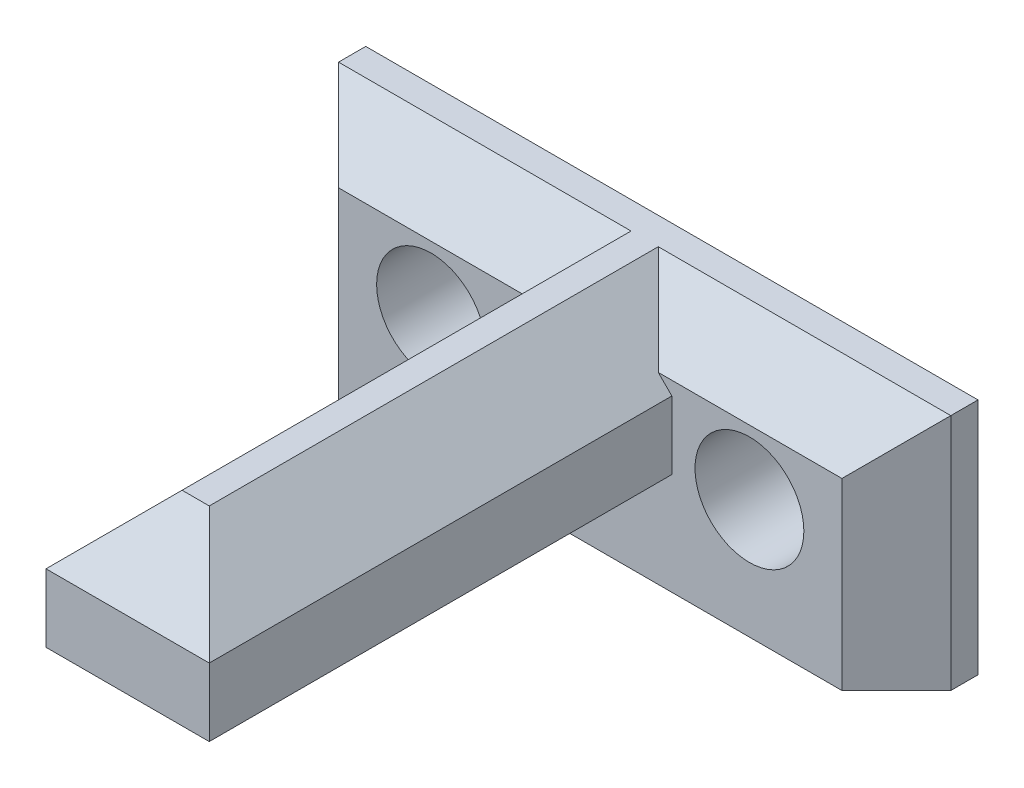
ISO-10303-21;
HEADER;
FILE_DESCRIPTION(('STEP AP214'),'2;1');
FILE_NAME('part.step','',(''),(''),'','','');
FILE_SCHEMA(('AUTOMOTIVE_DESIGN { 1 0 10303 214 1 1 1 1 }'));
ENDSEC;
DATA;
#1=APPLICATION_CONTEXT('core data for automotive mechanical design processes');
#2=APPLICATION_PROTOCOL_DEFINITION('international standard','automotive_design',2000,#1);
#3=PRODUCT_CONTEXT('',#1,'mechanical');
#4=PRODUCT('Part','Part','',(#3));
#5=PRODUCT_RELATED_PRODUCT_CATEGORY('part','',(#4));
#6=PRODUCT_DEFINITION_FORMATION('','',#4);
#7=PRODUCT_DEFINITION_CONTEXT('part definition',#1,'design');
#8=PRODUCT_DEFINITION('design','',#6,#7);
#9=PRODUCT_DEFINITION_SHAPE('','',#8);
#10=(LENGTH_UNIT() NAMED_UNIT(*) SI_UNIT(.MILLI.,.METRE.));
#11=(NAMED_UNIT(*) PLANE_ANGLE_UNIT() SI_UNIT($,.RADIAN.));
#12=(NAMED_UNIT(*) SI_UNIT($,.STERADIAN.) SOLID_ANGLE_UNIT());
#13=UNCERTAINTY_MEASURE_WITH_UNIT(LENGTH_MEASURE(1.E-05),#10,'distance_accuracy_value','');
#14=(GEOMETRIC_REPRESENTATION_CONTEXT(3) GLOBAL_UNCERTAINTY_ASSIGNED_CONTEXT((#13)) GLOBAL_UNIT_ASSIGNED_CONTEXT((#10,
#11,#12)) REPRESENTATION_CONTEXT('',''));
#15=CARTESIAN_POINT('',(0.,0.,0.));
#16=DIRECTION('',(0.,0.,1.));
#17=DIRECTION('',(1.,0.,0.));
#18=AXIS2_PLACEMENT_3D('',#15,#16,#17);
#19=CARTESIAN_POINT('',(0.,0.,3.));
#20=DIRECTION('',(0.,0.,-1.));
#21=DIRECTION('',(-1.,0.,0.));
#22=AXIS2_PLACEMENT_3D('',#19,#20,#21);
#23=PLANE('',#22);
#24=CARTESIAN_POINT('',(-5.85,0.,3.));
#25=DIRECTION('',(0.,0.,1.));
#26=DIRECTION('',(-1.,0.,0.));
#27=AXIS2_PLACEMENT_3D('',#24,#25,#26);
#28=CIRCLE('',#27,2.);
#29=CARTESIAN_POINT('',(-7.85,0.,3.));
#30=VERTEX_POINT('',#29);
#31=EDGE_CURVE('E190',#30,#30,#28,.T.);
#32=ORIENTED_EDGE('',*,*,#31,.F.);
#33=EDGE_LOOP('',(#32));
#34=FACE_BOUND('',#33,.T.);
#35=CARTESIAN_POINT('',(5.85,0.,3.));
#36=DIRECTION('',(0.,0.,1.));
#37=DIRECTION('',(1.,0.,0.));
#38=AXIS2_PLACEMENT_3D('',#35,#36,#37);
#39=CIRCLE('',#38,2.);
#40=CARTESIAN_POINT('',(7.85,0.,3.));
#41=VERTEX_POINT('',#40);
#42=EDGE_CURVE('E198',#41,#41,#39,.T.);
#43=ORIENTED_EDGE('',*,*,#42,.F.);
#44=EDGE_LOOP('',(#43));
#45=FACE_BOUND('',#44,.T.);
#46=DIRECTION('',(1.,0.,0.));
#47=VECTOR('',#46,1.);
#48=CARTESIAN_POINT('',(-11.25,-4.375,3.));
#49=LINE('',#48,#47);
#50=CARTESIAN_POINT('',(-9.25000000000001,-4.375,3.));
#51=VERTEX_POINT('',#50);
#52=CARTESIAN_POINT('',(9.25,-4.375,3.));
#53=VERTEX_POINT('',#52);
#54=EDGE_CURVE('E206',#51,#53,#49,.T.);
#55=ORIENTED_EDGE('',*,*,#54,.T.);
#56=DIRECTION('',(0.,1.,0.));
#57=VECTOR('',#56,1.);
#58=CARTESIAN_POINT('',(9.25000000000001,0.,3.));
#59=LINE('',#58,#57);
#60=CARTESIAN_POINT('',(9.25000000000001,2.37500000000001,3.));
#61=VERTEX_POINT('',#60);
#62=EDGE_CURVE('E244',#53,#61,#59,.T.);
#63=ORIENTED_EDGE('',*,*,#62,.T.);
#64=DIRECTION('',(-1.,0.,0.));
#65=VECTOR('',#64,1.);
#66=CARTESIAN_POINT('',(0.,2.37500000000001,3.));
#67=LINE('',#66,#65);
#68=CARTESIAN_POINT('',(2.49999999999999,2.37500000000001,3.));
#69=VERTEX_POINT('',#68);
#70=EDGE_CURVE('E70',#61,#69,#67,.T.);
#71=ORIENTED_EDGE('',*,*,#70,.T.);
#72=DIRECTION('',(-0.707106781186547,0.707106781186548,0.));
#73=VECTOR('',#72,1.);
#74=CARTESIAN_POINT('',(2.4375,2.4375,3.));
#75=LINE('',#74,#73);
#76=CARTESIAN_POINT('',(3.,1.875,3.));
#77=VERTEX_POINT('',#76);
#78=EDGE_CURVE('E290',#69,#77,#75,.F.);
#79=ORIENTED_EDGE('',*,*,#78,.T.);
#80=DIRECTION('',(0.,1.,0.));
#81=VECTOR('',#80,1.);
#82=CARTESIAN_POINT('',(3.,-0.625000000000001,3.));
#83=LINE('',#82,#81);
#84=CARTESIAN_POINT('',(3.,-0.625000000000001,3.));
#85=VERTEX_POINT('',#84);
#86=EDGE_CURVE('E169',#85,#77,#83,.T.);
#87=ORIENTED_EDGE('',*,*,#86,.F.);
#88=DIRECTION('',(1.,0.,0.));
#89=VECTOR('',#88,1.);
#90=CARTESIAN_POINT('',(0.,-0.625000000000001,3.));
#91=LINE('',#90,#89);
#92=CARTESIAN_POINT('',(-3.,-0.625000000000001,3.));
#93=VERTEX_POINT('',#92);
#94=EDGE_CURVE('E160',#93,#85,#91,.T.);
#95=ORIENTED_EDGE('',*,*,#94,.F.);
#96=DIRECTION('',(0.,1.,0.));
#97=VECTOR('',#96,1.);
#98=CARTESIAN_POINT('',(-3.,-0.625000000000001,3.));
#99=LINE('',#98,#97);
#100=CARTESIAN_POINT('',(-3.,1.875,3.));
#101=VERTEX_POINT('',#100);
#102=EDGE_CURVE('E144',#93,#101,#99,.T.);
#103=ORIENTED_EDGE('',*,*,#102,.T.);
#104=DIRECTION('',(0.707106781186547,0.707106781186548,0.));
#105=VECTOR('',#104,1.);
#106=CARTESIAN_POINT('',(-2.4375,2.4375,3.));
#107=LINE('',#106,#105);
#108=CARTESIAN_POINT('',(-2.49999999999999,2.37500000000001,3.));
#109=VERTEX_POINT('',#108);
#110=EDGE_CURVE('E55',#101,#109,#107,.T.);
#111=ORIENTED_EDGE('',*,*,#110,.T.);
#112=DIRECTION('',(-1.,0.,0.));
#113=VECTOR('',#112,1.);
#114=CARTESIAN_POINT('',(0.,2.37500000000001,3.));
#115=LINE('',#114,#113);
#116=CARTESIAN_POINT('',(-9.25,2.375,3.));
#117=VERTEX_POINT('',#116);
#118=EDGE_CURVE('E62',#109,#117,#115,.T.);
#119=ORIENTED_EDGE('',*,*,#118,.T.);
#120=DIRECTION('',(0.,-1.,0.));
#121=VECTOR('',#120,1.);
#122=CARTESIAN_POINT('',(-9.25,0.,3.));
#123=LINE('',#122,#121);
#124=EDGE_CURVE('E238',#117,#51,#123,.T.);
#125=ORIENTED_EDGE('',*,*,#124,.T.);
#126=EDGE_LOOP('',(#55,#63,#71,#79,#87,#95,#103,#111,#119,#125));
#127=FACE_BOUND('',#126,.T.);
#128=ADVANCED_FACE('F44',(#34,#45,#127),#23,.F.);
#129=CARTESIAN_POINT('',(0.,0.,0.));
#130=DIRECTION('',(0.,0.,-1.));
#131=DIRECTION('',(-1.,0.,0.));
#132=AXIS2_PLACEMENT_3D('',#129,#130,#131);
#133=PLANE('',#132);
#134=CARTESIAN_POINT('',(5.85,0.,0.));
#135=DIRECTION('',(0.,0.,1.));
#136=DIRECTION('',(1.,0.,0.));
#137=AXIS2_PLACEMENT_3D('',#134,#135,#136);
#138=CIRCLE('',#137,2.);
#139=CARTESIAN_POINT('',(7.85,0.,0.));
#140=VERTEX_POINT('',#139);
#141=EDGE_CURVE('E194',#140,#140,#138,.T.);
#142=ORIENTED_EDGE('',*,*,#141,.T.);
#143=EDGE_LOOP('',(#142));
#144=FACE_BOUND('',#143,.T.);
#145=DIRECTION('',(0.,1.,0.));
#146=VECTOR('',#145,1.);
#147=CARTESIAN_POINT('',(11.25,-4.375,0.));
#148=LINE('',#147,#146);
#149=CARTESIAN_POINT('',(11.25,-4.375,0.));
#150=VERTEX_POINT('',#149);
#151=CARTESIAN_POINT('',(11.25,4.375,0.));
#152=VERTEX_POINT('',#151);
#153=EDGE_CURVE('E202',#150,#152,#148,.T.);
#154=ORIENTED_EDGE('',*,*,#153,.F.);
#155=DIRECTION('',(1.,0.,0.));
#156=VECTOR('',#155,1.);
#157=CARTESIAN_POINT('',(-11.25,-4.375,0.));
#158=LINE('',#157,#156);
#159=CARTESIAN_POINT('',(-11.25,-4.375,0.));
#160=VERTEX_POINT('',#159);
#161=EDGE_CURVE('E210',#160,#150,#158,.T.);
#162=ORIENTED_EDGE('',*,*,#161,.F.);
#163=DIRECTION('',(0.,-1.,0.));
#164=VECTOR('',#163,1.);
#165=CARTESIAN_POINT('',(-11.25,-4.375,0.));
#166=LINE('',#165,#164);
#167=CARTESIAN_POINT('',(-11.25,4.375,0.));
#168=VERTEX_POINT('',#167);
#169=EDGE_CURVE('E218',#168,#160,#166,.T.);
#170=ORIENTED_EDGE('',*,*,#169,.F.);
#171=DIRECTION('',(-1.,0.,0.));
#172=VECTOR('',#171,1.);
#173=CARTESIAN_POINT('',(-11.25,4.375,0.));
#174=LINE('',#173,#172);
#175=EDGE_CURVE('E214',#152,#168,#174,.T.);
#176=ORIENTED_EDGE('',*,*,#175,.F.);
#177=EDGE_LOOP('',(#154,#162,#170,#176));
#178=FACE_BOUND('',#177,.T.);
#179=CARTESIAN_POINT('',(-5.85,0.,0.));
#180=DIRECTION('',(0.,0.,1.));
#181=DIRECTION('',(-1.,0.,0.));
#182=AXIS2_PLACEMENT_3D('',#179,#180,#181);
#183=CIRCLE('',#182,2.);
#184=CARTESIAN_POINT('',(-7.85,0.,0.));
#185=VERTEX_POINT('',#184);
#186=EDGE_CURVE('E183',#185,#185,#183,.T.);
#187=ORIENTED_EDGE('',*,*,#186,.T.);
#188=EDGE_LOOP('',(#187));
#189=FACE_BOUND('',#188,.T.);
#190=ADVANCED_FACE('F329',(#144,#178,#189),#133,.T.);
#191=CARTESIAN_POINT('',(11.25,-4.375,3.));
#192=DIRECTION('',(-1.,0.,0.));
#193=DIRECTION('',(0.,0.,1.));
#194=AXIS2_PLACEMENT_3D('',#191,#192,#193);
#195=PLANE('',#194);
#196=DIRECTION('',(0.,0.,-1.));
#197=VECTOR('',#196,1.);
#198=CARTESIAN_POINT('',(11.25,4.375,3.));
#199=LINE('',#198,#197);
#200=CARTESIAN_POINT('',(11.25,4.375,1.));
#201=VERTEX_POINT('',#200);
#202=EDGE_CURVE('E233',#201,#152,#199,.T.);
#203=ORIENTED_EDGE('',*,*,#202,.F.);
#204=DIRECTION('',(0.,-1.,0.));
#205=VECTOR('',#204,1.);
#206=CARTESIAN_POINT('',(11.25,-4.375,1.));
#207=LINE('',#206,#205);
#208=CARTESIAN_POINT('',(11.25,-4.375,1.));
#209=VERTEX_POINT('',#208);
#210=EDGE_CURVE('E247',#201,#209,#207,.T.);
#211=ORIENTED_EDGE('',*,*,#210,.T.);
#212=DIRECTION('',(0.,0.,-1.));
#213=VECTOR('',#212,1.);
#214=CARTESIAN_POINT('',(11.25,-4.375,3.));
#215=LINE('',#214,#213);
#216=EDGE_CURVE('E209',#209,#150,#215,.T.);
#217=ORIENTED_EDGE('',*,*,#216,.T.);
#218=ORIENTED_EDGE('',*,*,#153,.T.);
#219=EDGE_LOOP('',(#203,#211,#217,#218));
#220=FACE_BOUND('',#219,.T.);
#221=ADVANCED_FACE('F363',(#220),#195,.F.);
#222=CARTESIAN_POINT('',(-11.25,4.375,3.));
#223=DIRECTION('',(0.,-1.,0.));
#224=DIRECTION('',(1.,0.,0.));
#225=AXIS2_PLACEMENT_3D('',#222,#223,#224);
#226=PLANE('',#225);
#227=DIRECTION('',(0.,0.,-1.));
#228=VECTOR('',#227,1.);
#229=CARTESIAN_POINT('',(0.500000000000002,4.375,3.));
#230=LINE('',#229,#228);
#231=CARTESIAN_POINT('',(0.500000000000004,4.375,17.5));
#232=VERTEX_POINT('',#231);
#233=CARTESIAN_POINT('',(0.500000000000002,4.375,1.));
#234=VERTEX_POINT('',#233);
#235=EDGE_CURVE('E278',#232,#234,#230,.T.);
#236=ORIENTED_EDGE('',*,*,#235,.T.);
#237=DIRECTION('',(1.,0.,0.));
#238=VECTOR('',#237,1.);
#239=CARTESIAN_POINT('',(-11.25,4.375,1.));
#240=LINE('',#239,#238);
#241=EDGE_CURVE('E259',#234,#201,#240,.T.);
#242=ORIENTED_EDGE('',*,*,#241,.T.);
#243=ORIENTED_EDGE('',*,*,#202,.T.);
#244=ORIENTED_EDGE('',*,*,#175,.T.);
#245=DIRECTION('',(0.,0.,-1.));
#246=VECTOR('',#245,1.);
#247=CARTESIAN_POINT('',(-11.25,4.375,3.));
#248=LINE('',#247,#246);
#249=CARTESIAN_POINT('',(-11.25,4.375,1.));
#250=VERTEX_POINT('',#249);
#251=EDGE_CURVE('E230',#250,#168,#248,.T.);
#252=ORIENTED_EDGE('',*,*,#251,.F.);
#253=DIRECTION('',(1.,0.,0.));
#254=VECTOR('',#253,1.);
#255=CARTESIAN_POINT('',(-11.25,4.375,1.));
#256=LINE('',#255,#254);
#257=CARTESIAN_POINT('',(-0.5,4.375,1.));
#258=VERTEX_POINT('',#257);
#259=EDGE_CURVE('E256',#250,#258,#256,.T.);
#260=ORIENTED_EDGE('',*,*,#259,.T.);
#261=DIRECTION('',(0.,0.,1.));
#262=VECTOR('',#261,1.);
#263=CARTESIAN_POINT('',(-0.500000000000004,4.375,20.));
#264=LINE('',#263,#262);
#265=CARTESIAN_POINT('',(-0.500000000000003,4.375,17.5));
#266=VERTEX_POINT('',#265);
#267=EDGE_CURVE('E272',#258,#266,#264,.T.);
#268=ORIENTED_EDGE('',*,*,#267,.T.);
#269=DIRECTION('',(1.,0.,0.));
#270=VECTOR('',#269,1.);
#271=CARTESIAN_POINT('',(-11.25,4.375,17.5));
#272=LINE('',#271,#270);
#273=EDGE_CURVE('E275',#266,#232,#272,.T.);
#274=ORIENTED_EDGE('',*,*,#273,.T.);
#275=EDGE_LOOP('',(#236,#242,#243,#244,#252,#260,#268,#274));
#276=FACE_BOUND('',#275,.T.);
#277=ADVANCED_FACE('F376',(#276),#226,.F.);
#278=CARTESIAN_POINT('',(-11.25,-4.375,3.));
#279=DIRECTION('',(1.,0.,0.));
#280=DIRECTION('',(0.,0.,-1.));
#281=AXIS2_PLACEMENT_3D('',#278,#279,#280);
#282=PLANE('',#281);
#283=DIRECTION('',(0.,0.,-1.));
#284=VECTOR('',#283,1.);
#285=CARTESIAN_POINT('',(-11.25,-4.375,3.));
#286=LINE('',#285,#284);
#287=CARTESIAN_POINT('',(-11.25,-4.375,1.));
#288=VERTEX_POINT('',#287);
#289=EDGE_CURVE('E227',#288,#160,#286,.T.);
#290=ORIENTED_EDGE('',*,*,#289,.F.);
#291=DIRECTION('',(0.,1.,0.));
#292=VECTOR('',#291,1.);
#293=CARTESIAN_POINT('',(-11.25,-4.375,1.));
#294=LINE('',#293,#292);
#295=EDGE_CURVE('E262',#288,#250,#294,.T.);
#296=ORIENTED_EDGE('',*,*,#295,.T.);
#297=ORIENTED_EDGE('',*,*,#251,.T.);
#298=ORIENTED_EDGE('',*,*,#169,.T.);
#299=EDGE_LOOP('',(#290,#296,#297,#298));
#300=FACE_BOUND('',#299,.T.);
#301=ADVANCED_FACE('F322',(#300),#282,.F.);
#302=CARTESIAN_POINT('',(-11.25,-4.375,3.));
#303=DIRECTION('',(0.,1.,0.));
#304=DIRECTION('',(0.,0.,1.));
#305=AXIS2_PLACEMENT_3D('',#302,#303,#304);
#306=PLANE('',#305);
#307=ORIENTED_EDGE('',*,*,#216,.F.);
#308=DIRECTION('',(0.707106781186547,0.,-0.707106781186548));
#309=VECTOR('',#308,1.);
#310=CARTESIAN_POINT('',(9.25000000000001,-4.375,3.));
#311=LINE('',#310,#309);
#312=EDGE_CURVE('E253',#209,#53,#311,.F.);
#313=ORIENTED_EDGE('',*,*,#312,.T.);
#314=ORIENTED_EDGE('',*,*,#54,.F.);
#315=DIRECTION('',(0.707106781186547,0.,0.707106781186548));
#316=VECTOR('',#315,1.);
#317=CARTESIAN_POINT('',(-9.25,-4.375,3.));
#318=LINE('',#317,#316);
#319=EDGE_CURVE('E250',#51,#288,#318,.F.);
#320=ORIENTED_EDGE('',*,*,#319,.T.);
#321=ORIENTED_EDGE('',*,*,#289,.T.);
#322=ORIENTED_EDGE('',*,*,#161,.T.);
#323=EDGE_LOOP('',(#307,#313,#314,#320,#321,#322));
#324=FACE_BOUND('',#323,.T.);
#325=ADVANCED_FACE('F320',(#324),#306,.F.);
#326=CARTESIAN_POINT('',(5.85,0.,3.));
#327=DIRECTION('',(0.,0.,-1.));
#328=DIRECTION('',(-1.,0.,0.));
#329=AXIS2_PLACEMENT_3D('',#326,#327,#328);
#330=CYLINDRICAL_SURFACE('',#329,2.);
#331=ORIENTED_EDGE('',*,*,#42,.T.);
#332=EDGE_LOOP('',(#331));
#333=FACE_BOUND('',#332,.T.);
#334=ORIENTED_EDGE('',*,*,#141,.F.);
#335=EDGE_LOOP('',(#334));
#336=FACE_BOUND('',#335,.T.);
#337=ADVANCED_FACE('F369',(#333,#336),#330,.F.);
#338=CARTESIAN_POINT('',(-5.85,0.,3.));
#339=DIRECTION('',(0.,0.,-1.));
#340=DIRECTION('',(-1.,0.,0.));
#341=AXIS2_PLACEMENT_3D('',#338,#339,#340);
#342=CYLINDRICAL_SURFACE('',#341,2.);
#343=ORIENTED_EDGE('',*,*,#31,.T.);
#344=EDGE_LOOP('',(#343));
#345=FACE_BOUND('',#344,.T.);
#346=ORIENTED_EDGE('',*,*,#186,.F.);
#347=EDGE_LOOP('',(#346));
#348=FACE_BOUND('',#347,.T.);
#349=ADVANCED_FACE('F355',(#345,#348),#342,.F.);
#350=CARTESIAN_POINT('',(3.,-0.625000000000001,0.));
#351=DIRECTION('',(-1.,0.,0.));
#352=DIRECTION('',(0.,0.,1.));
#353=AXIS2_PLACEMENT_3D('',#350,#351,#352);
#354=PLANE('',#353);
#355=ORIENTED_EDGE('',*,*,#86,.T.);
#356=DIRECTION('',(0.,0.,1.));
#357=VECTOR('',#356,1.);
#358=CARTESIAN_POINT('',(3.,1.875,0.));
#359=LINE('',#358,#357);
#360=CARTESIAN_POINT('',(3.,1.875,20.));
#361=VERTEX_POINT('',#360);
#362=EDGE_CURVE('E264',#77,#361,#359,.T.);
#363=ORIENTED_EDGE('',*,*,#362,.T.);
#364=DIRECTION('',(0.,1.,0.));
#365=VECTOR('',#364,1.);
#366=CARTESIAN_POINT('',(3.,-0.625000000000001,20.));
#367=LINE('',#366,#365);
#368=CARTESIAN_POINT('',(3.,-0.625000000000001,20.));
#369=VERTEX_POINT('',#368);
#370=EDGE_CURVE('E184',#369,#361,#367,.T.);
#371=ORIENTED_EDGE('',*,*,#370,.F.);
#372=DIRECTION('',(0.,0.,1.));
#373=VECTOR('',#372,1.);
#374=CARTESIAN_POINT('',(3.,-0.625000000000001,0.));
#375=LINE('',#374,#373);
#376=EDGE_CURVE('E155',#85,#369,#375,.T.);
#377=ORIENTED_EDGE('',*,*,#376,.F.);
#378=EDGE_LOOP('',(#355,#363,#371,#377));
#379=FACE_BOUND('',#378,.T.);
#380=ADVANCED_FACE('F344',(#379),#354,.F.);
#381=CARTESIAN_POINT('',(0.,-0.625000000000001,20.));
#382=DIRECTION('',(0.,0.,-1.));
#383=DIRECTION('',(-1.,0.,0.));
#384=AXIS2_PLACEMENT_3D('',#381,#382,#383);
#385=PLANE('',#384);
#386=ORIENTED_EDGE('',*,*,#370,.T.);
#387=DIRECTION('',(-1.,0.,0.));
#388=VECTOR('',#387,1.);
#389=CARTESIAN_POINT('',(0.,1.875,20.));
#390=LINE('',#389,#388);
#391=CARTESIAN_POINT('',(-3.,1.875,20.));
#392=VERTEX_POINT('',#391);
#393=EDGE_CURVE('E282',#361,#392,#390,.T.);
#394=ORIENTED_EDGE('',*,*,#393,.T.);
#395=DIRECTION('',(0.,1.,0.));
#396=VECTOR('',#395,1.);
#397=CARTESIAN_POINT('',(-3.,-0.625000000000001,20.));
#398=LINE('',#397,#396);
#399=CARTESIAN_POINT('',(-3.,-0.625000000000001,20.));
#400=VERTEX_POINT('',#399);
#401=EDGE_CURVE('E154',#400,#392,#398,.T.);
#402=ORIENTED_EDGE('',*,*,#401,.F.);
#403=DIRECTION('',(-1.,0.,0.));
#404=VECTOR('',#403,1.);
#405=CARTESIAN_POINT('',(0.,-0.625000000000001,20.));
#406=LINE('',#405,#404);
#407=EDGE_CURVE('E163',#369,#400,#406,.T.);
#408=ORIENTED_EDGE('',*,*,#407,.F.);
#409=EDGE_LOOP('',(#386,#394,#402,#408));
#410=FACE_BOUND('',#409,.T.);
#411=ADVANCED_FACE('F347',(#410),#385,.F.);
#412=CARTESIAN_POINT('',(-3.,-0.625000000000001,0.));
#413=DIRECTION('',(-1.,0.,0.));
#414=DIRECTION('',(0.,0.,1.));
#415=AXIS2_PLACEMENT_3D('',#412,#413,#414);
#416=PLANE('',#415);
#417=ORIENTED_EDGE('',*,*,#401,.T.);
#418=DIRECTION('',(0.,0.,-1.));
#419=VECTOR('',#418,1.);
#420=CARTESIAN_POINT('',(-3.,1.875,1.));
#421=LINE('',#420,#419);
#422=EDGE_CURVE('E150',#392,#101,#421,.T.);
#423=ORIENTED_EDGE('',*,*,#422,.T.);
#424=ORIENTED_EDGE('',*,*,#102,.F.);
#425=DIRECTION('',(0.,0.,1.));
#426=VECTOR('',#425,1.);
#427=CARTESIAN_POINT('',(-3.,-0.625000000000001,0.));
#428=LINE('',#427,#426);
#429=EDGE_CURVE('E148',#93,#400,#428,.T.);
#430=ORIENTED_EDGE('',*,*,#429,.T.);
#431=EDGE_LOOP('',(#417,#423,#424,#430));
#432=FACE_BOUND('',#431,.T.);
#433=ADVANCED_FACE('F147',(#432),#416,.T.);
#434=CARTESIAN_POINT('',(0.,-0.625000000000001,0.));
#435=DIRECTION('',(0.,1.,0.));
#436=DIRECTION('',(-1.,0.,0.));
#437=AXIS2_PLACEMENT_3D('',#434,#435,#436);
#438=PLANE('',#437);
#439=ORIENTED_EDGE('',*,*,#94,.T.);
#440=ORIENTED_EDGE('',*,*,#376,.T.);
#441=ORIENTED_EDGE('',*,*,#407,.T.);
#442=ORIENTED_EDGE('',*,*,#429,.F.);
#443=EDGE_LOOP('',(#439,#440,#441,#442));
#444=FACE_BOUND('',#443,.T.);
#445=ADVANCED_FACE('F159',(#444),#438,.F.);
#446=CARTESIAN_POINT('',(0.,2.37500000000001,3.));
#447=DIRECTION('',(0.,-0.707106781186548,-0.707106781186547));
#448=DIRECTION('',(-1.,0.,0.));
#449=AXIS2_PLACEMENT_3D('',#446,#447,#448);
#450=PLANE('',#449);
#451=ORIENTED_EDGE('',*,*,#241,.F.);
#452=DIRECTION('',(0.577350269189625,-0.577350269189626,0.577350269189627));
#453=VECTOR('',#452,1.);
#454=CARTESIAN_POINT('',(1.83333333333333,3.04166666666667,2.33333333333333));
#455=LINE('',#454,#453);
#456=EDGE_CURVE('E287',#234,#69,#455,.T.);
#457=ORIENTED_EDGE('',*,*,#456,.T.);
#458=ORIENTED_EDGE('',*,*,#70,.F.);
#459=DIRECTION('',(0.577350269189625,0.577350269189625,-0.577350269189626));
#460=VECTOR('',#459,1.);
#461=CARTESIAN_POINT('',(6.16666666666667,-0.708333333333327,6.08333333333334));
#462=LINE('',#461,#460);
#463=EDGE_CURVE('E171',#201,#61,#462,.F.);
#464=ORIENTED_EDGE('',*,*,#463,.F.);
#465=EDGE_LOOP('',(#451,#457,#458,#464));
#466=FACE_BOUND('',#465,.T.);
#467=ADVANCED_FACE('F339',(#466),#450,.F.);
#468=CARTESIAN_POINT('',(9.25000000000001,0.,3.));
#469=DIRECTION('',(-0.707106781186548,0.,-0.707106781186547));
#470=DIRECTION('',(0.,1.,0.));
#471=AXIS2_PLACEMENT_3D('',#468,#469,#470);
#472=PLANE('',#471);
#473=ORIENTED_EDGE('',*,*,#312,.F.);
#474=ORIENTED_EDGE('',*,*,#210,.F.);
#475=ORIENTED_EDGE('',*,*,#463,.T.);
#476=ORIENTED_EDGE('',*,*,#62,.F.);
#477=EDGE_LOOP('',(#473,#474,#475,#476));
#478=FACE_BOUND('',#477,.T.);
#479=ADVANCED_FACE('F336',(#478),#472,.F.);
#480=CARTESIAN_POINT('',(0.,2.37500000000001,3.));
#481=DIRECTION('',(0.,-0.707106781186548,-0.707106781186547));
#482=DIRECTION('',(-1.,0.,0.));
#483=AXIS2_PLACEMENT_3D('',#480,#481,#482);
#484=PLANE('',#483);
#485=ORIENTED_EDGE('',*,*,#118,.F.);
#486=DIRECTION('',(-0.577350269189625,-0.577350269189626,0.577350269189627));
#487=VECTOR('',#486,1.);
#488=CARTESIAN_POINT('',(-1.16666666666667,3.70833333333333,1.66666666666667));
#489=LINE('',#488,#487);
#490=EDGE_CURVE('E11',#109,#258,#489,.F.);
#491=ORIENTED_EDGE('',*,*,#490,.T.);
#492=ORIENTED_EDGE('',*,*,#259,.F.);
#493=DIRECTION('',(0.577350269189625,-0.577350269189625,0.577350269189626));
#494=VECTOR('',#493,1.);
#495=CARTESIAN_POINT('',(-6.16666666666667,-0.708333333333326,6.08333333333334));
#496=LINE('',#495,#494);
#497=EDGE_CURVE('E174',#117,#250,#496,.F.);
#498=ORIENTED_EDGE('',*,*,#497,.F.);
#499=EDGE_LOOP('',(#485,#491,#492,#498));
#500=FACE_BOUND('',#499,.T.);
#501=ADVANCED_FACE('F313',(#500),#484,.F.);
#502=CARTESIAN_POINT('',(-9.25,0.,3.));
#503=DIRECTION('',(0.707106781186548,0.,-0.707106781186547));
#504=DIRECTION('',(0.,-1.,0.));
#505=AXIS2_PLACEMENT_3D('',#502,#503,#504);
#506=PLANE('',#505);
#507=ORIENTED_EDGE('',*,*,#497,.T.);
#508=ORIENTED_EDGE('',*,*,#295,.F.);
#509=ORIENTED_EDGE('',*,*,#319,.F.);
#510=ORIENTED_EDGE('',*,*,#124,.F.);
#511=EDGE_LOOP('',(#507,#508,#509,#510));
#512=FACE_BOUND('',#511,.T.);
#513=ADVANCED_FACE('F316',(#512),#506,.F.);
#514=CARTESIAN_POINT('',(-0.500000000000002,4.375,3.));
#515=DIRECTION('',(-0.707106781186548,0.707106781186547,0.));
#516=DIRECTION('',(0.,0.,-1.));
#517=AXIS2_PLACEMENT_3D('',#514,#515,#516);
#518=PLANE('',#517);
#519=ORIENTED_EDGE('',*,*,#110,.F.);
#520=ORIENTED_EDGE('',*,*,#422,.F.);
#521=DIRECTION('',(-0.577350269189626,-0.577350269189626,0.577350269189625));
#522=VECTOR('',#521,1.);
#523=CARTESIAN_POINT('',(4.33333333333333,9.20833333333334,12.6666666666667));
#524=LINE('',#523,#522);
#525=EDGE_CURVE('E49',#266,#392,#524,.T.);
#526=ORIENTED_EDGE('',*,*,#525,.F.);
#527=ORIENTED_EDGE('',*,*,#267,.F.);
#528=ORIENTED_EDGE('',*,*,#490,.F.);
#529=EDGE_LOOP('',(#519,#520,#526,#527,#528));
#530=FACE_BOUND('',#529,.T.);
#531=ADVANCED_FACE('F47',(#530),#518,.T.);
#532=CARTESIAN_POINT('',(0.,1.875,20.));
#533=DIRECTION('',(0.,-0.707106781186547,-0.707106781186548));
#534=DIRECTION('',(-1.,0.,0.));
#535=AXIS2_PLACEMENT_3D('',#532,#533,#534);
#536=PLANE('',#535);
#537=ORIENTED_EDGE('',*,*,#525,.T.);
#538=ORIENTED_EDGE('',*,*,#393,.F.);
#539=DIRECTION('',(-0.577350269189625,0.577350269189626,-0.577350269189626));
#540=VECTOR('',#539,1.);
#541=CARTESIAN_POINT('',(2.,2.875,19.));
#542=LINE('',#541,#540);
#543=EDGE_CURVE('E294',#232,#361,#542,.F.);
#544=ORIENTED_EDGE('',*,*,#543,.F.);
#545=ORIENTED_EDGE('',*,*,#273,.F.);
#546=EDGE_LOOP('',(#537,#538,#544,#545));
#547=FACE_BOUND('',#546,.T.);
#548=ADVANCED_FACE('F306',(#547),#536,.F.);
#549=CARTESIAN_POINT('',(3.,1.875,0.));
#550=DIRECTION('',(-0.707106781186548,-0.707106781186547,0.));
#551=DIRECTION('',(0.,0.,1.));
#552=AXIS2_PLACEMENT_3D('',#549,#550,#551);
#553=PLANE('',#552);
#554=ORIENTED_EDGE('',*,*,#456,.F.);
#555=ORIENTED_EDGE('',*,*,#235,.F.);
#556=ORIENTED_EDGE('',*,*,#543,.T.);
#557=ORIENTED_EDGE('',*,*,#362,.F.);
#558=ORIENTED_EDGE('',*,*,#78,.F.);
#559=EDGE_LOOP('',(#554,#555,#556,#557,#558));
#560=FACE_BOUND('',#559,.T.);
#561=ADVANCED_FACE('F342',(#560),#553,.F.);
#562=CLOSED_SHELL('',(#128,#190,#221,#277,#301,#325,#337,#349,#380,#411,#433,#445,#467,#479,
#501,#513,#531,#548,#561));
#563=MANIFOLD_SOLID_BREP('B2',#562);
#564=ADVANCED_BREP_SHAPE_REPRESENTATION('',(#18,#563),#14);
#565=SHAPE_DEFINITION_REPRESENTATION(#9,#564);
ENDSEC;
END-ISO-10303-21;
